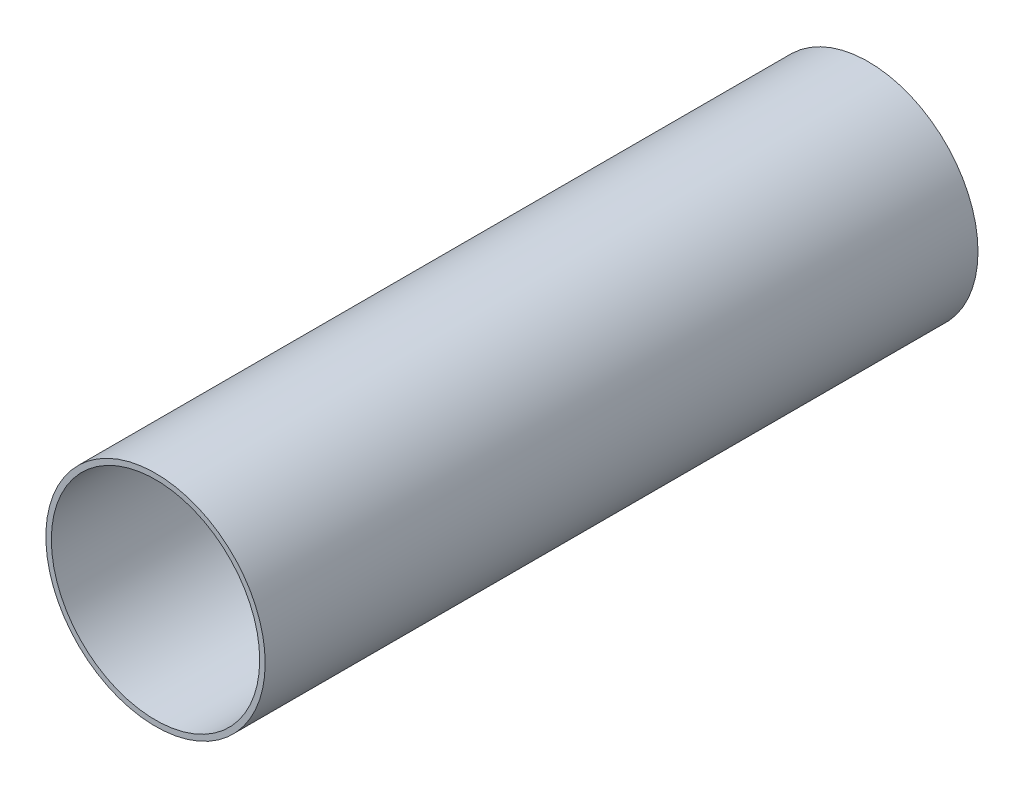
ISO-10303-21;
HEADER;
FILE_DESCRIPTION(('STEP AP214'),'2;1');
FILE_NAME('part.step','',(''),(''),'','','');
FILE_SCHEMA(('AUTOMOTIVE_DESIGN { 1 0 10303 214 1 1 1 1 }'));
ENDSEC;
DATA;
#1=APPLICATION_CONTEXT('core data for automotive mechanical design processes');
#2=APPLICATION_PROTOCOL_DEFINITION('international standard','automotive_design',2000,#1);
#3=PRODUCT_CONTEXT('',#1,'mechanical');
#4=PRODUCT('Part','Part','',(#3));
#5=PRODUCT_RELATED_PRODUCT_CATEGORY('part','',(#4));
#6=PRODUCT_DEFINITION_FORMATION('','',#4);
#7=PRODUCT_DEFINITION_CONTEXT('part definition',#1,'design');
#8=PRODUCT_DEFINITION('design','',#6,#7);
#9=PRODUCT_DEFINITION_SHAPE('','',#8);
#10=(LENGTH_UNIT() NAMED_UNIT(*) SI_UNIT(.MILLI.,.METRE.));
#11=(NAMED_UNIT(*) PLANE_ANGLE_UNIT() SI_UNIT($,.RADIAN.));
#12=(NAMED_UNIT(*) SI_UNIT($,.STERADIAN.) SOLID_ANGLE_UNIT());
#13=UNCERTAINTY_MEASURE_WITH_UNIT(LENGTH_MEASURE(1.E-05),#10,'distance_accuracy_value','');
#14=(GEOMETRIC_REPRESENTATION_CONTEXT(3) GLOBAL_UNCERTAINTY_ASSIGNED_CONTEXT((#13)) GLOBAL_UNIT_ASSIGNED_CONTEXT((#10,
#11,#12)) REPRESENTATION_CONTEXT('',''));
#15=CARTESIAN_POINT('',(0.,0.,0.));
#16=DIRECTION('',(0.,0.,1.));
#17=DIRECTION('',(1.,0.,0.));
#18=AXIS2_PLACEMENT_3D('',#15,#16,#17);
#19=CARTESIAN_POINT('',(0.,0.,65.));
#20=DIRECTION('',(0.,0.,1.));
#21=DIRECTION('',(1.,0.,0.));
#22=AXIS2_PLACEMENT_3D('',#19,#20,#21);
#23=PLANE('',#22);
#24=CARTESIAN_POINT('',(0.,0.,65.));
#25=DIRECTION('',(0.,0.,1.));
#26=DIRECTION('',(1.,0.,0.));
#27=AXIS2_PLACEMENT_3D('',#24,#25,#26);
#28=CIRCLE('',#27,20.);
#29=CARTESIAN_POINT('',(20.,0.,65.));
#30=VERTEX_POINT('',#29);
#31=EDGE_CURVE('E10',#30,#30,#28,.T.);
#32=ORIENTED_EDGE('',*,*,#31,.T.);
#33=EDGE_LOOP('',(#32));
#34=FACE_BOUND('',#33,.T.);
#35=CARTESIAN_POINT('',(0.,0.,65.));
#36=DIRECTION('',(0.,0.,1.));
#37=DIRECTION('',(1.,0.,0.));
#38=AXIS2_PLACEMENT_3D('',#35,#36,#37);
#39=CIRCLE('',#38,19.);
#40=CARTESIAN_POINT('',(19.,0.,65.));
#41=VERTEX_POINT('',#40);
#42=EDGE_CURVE('E45',#41,#41,#39,.T.);
#43=ORIENTED_EDGE('',*,*,#42,.F.);
#44=EDGE_LOOP('',(#43));
#45=FACE_BOUND('',#44,.T.);
#46=ADVANCED_FACE('F34',(#34,#45),#23,.T.);
#47=CARTESIAN_POINT('',(0.,0.,-65.));
#48=DIRECTION('',(0.,0.,1.));
#49=DIRECTION('',(1.,0.,0.));
#50=AXIS2_PLACEMENT_3D('',#47,#48,#49);
#51=PLANE('',#50);
#52=CARTESIAN_POINT('',(0.,0.,-65.));
#53=DIRECTION('',(0.,0.,1.));
#54=DIRECTION('',(1.,0.,0.));
#55=AXIS2_PLACEMENT_3D('',#52,#53,#54);
#56=CIRCLE('',#55,20.);
#57=CARTESIAN_POINT('',(20.,0.,-65.));
#58=VERTEX_POINT('',#57);
#59=EDGE_CURVE('E38',#58,#58,#56,.T.);
#60=ORIENTED_EDGE('',*,*,#59,.F.);
#61=EDGE_LOOP('',(#60));
#62=FACE_BOUND('',#61,.T.);
#63=CARTESIAN_POINT('',(0.,0.,-65.));
#64=DIRECTION('',(0.,0.,1.));
#65=DIRECTION('',(1.,0.,0.));
#66=AXIS2_PLACEMENT_3D('',#63,#64,#65);
#67=CIRCLE('',#66,19.);
#68=CARTESIAN_POINT('',(19.,0.,-65.));
#69=VERTEX_POINT('',#68);
#70=EDGE_CURVE('E47',#69,#69,#67,.T.);
#71=ORIENTED_EDGE('',*,*,#70,.T.);
#72=EDGE_LOOP('',(#71));
#73=FACE_BOUND('',#72,.T.);
#74=ADVANCED_FACE('F57',(#62,#73),#51,.F.);
#75=CARTESIAN_POINT('',(0.,0.,65.));
#76=DIRECTION('',(0.,0.,-1.));
#77=DIRECTION('',(-1.,0.,0.));
#78=AXIS2_PLACEMENT_3D('',#75,#76,#77);
#79=CYLINDRICAL_SURFACE('',#78,20.);
#80=ORIENTED_EDGE('',*,*,#31,.F.);
#81=EDGE_LOOP('',(#80));
#82=FACE_BOUND('',#81,.T.);
#83=ORIENTED_EDGE('',*,*,#59,.T.);
#84=EDGE_LOOP('',(#83));
#85=FACE_BOUND('',#84,.T.);
#86=ADVANCED_FACE('F36',(#82,#85),#79,.T.);
#87=CARTESIAN_POINT('',(0.,0.,65.));
#88=DIRECTION('',(0.,0.,-1.));
#89=DIRECTION('',(-1.,0.,0.));
#90=AXIS2_PLACEMENT_3D('',#87,#88,#89);
#91=CYLINDRICAL_SURFACE('',#90,19.);
#92=ORIENTED_EDGE('',*,*,#42,.T.);
#93=EDGE_LOOP('',(#92));
#94=FACE_BOUND('',#93,.T.);
#95=ORIENTED_EDGE('',*,*,#70,.F.);
#96=EDGE_LOOP('',(#95));
#97=FACE_BOUND('',#96,.T.);
#98=ADVANCED_FACE('F53',(#94,#97),#91,.F.);
#99=CLOSED_SHELL('',(#46,#74,#86,#98));
#100=MANIFOLD_SOLID_BREP('B2',#99);
#101=ADVANCED_BREP_SHAPE_REPRESENTATION('',(#18,#100),#14);
#102=SHAPE_DEFINITION_REPRESENTATION(#9,#101);
ENDSEC;
END-ISO-10303-21;
